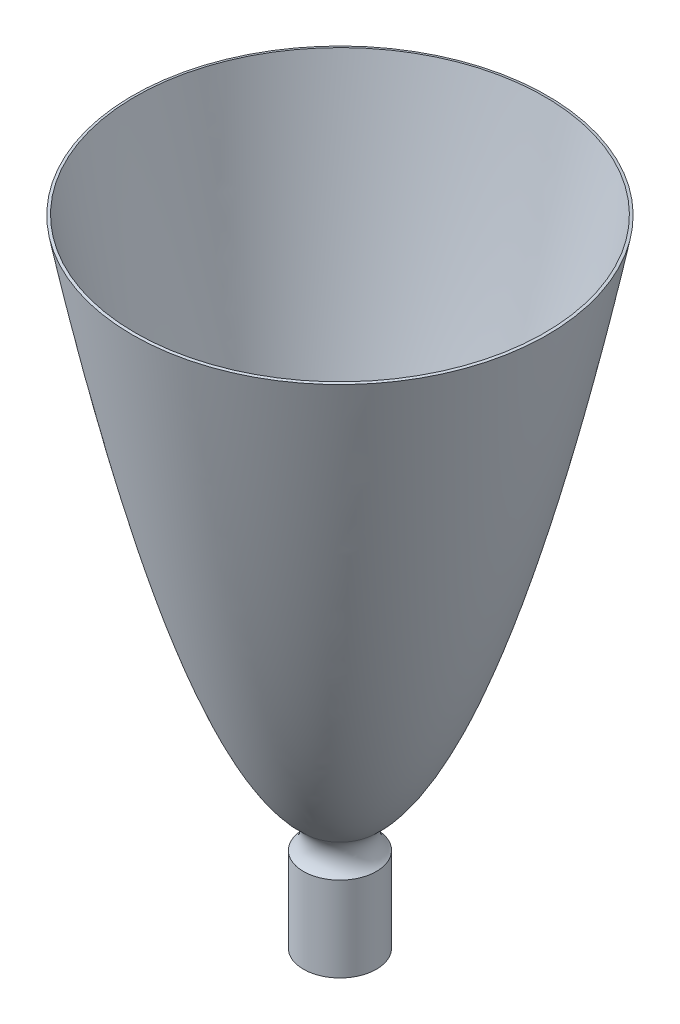
ISO-10303-21;
HEADER;
FILE_DESCRIPTION(('STEP AP214'),'2;1');
FILE_NAME('part.step','',(''),(''),'','','');
FILE_SCHEMA(('AUTOMOTIVE_DESIGN { 1 0 10303 214 1 1 1 1 }'));
ENDSEC;
DATA;
#1=APPLICATION_CONTEXT('core data for automotive mechanical design processes');
#2=APPLICATION_PROTOCOL_DEFINITION('international standard','automotive_design',2000,#1);
#3=PRODUCT_CONTEXT('',#1,'mechanical');
#4=PRODUCT('Part','Part','',(#3));
#5=PRODUCT_RELATED_PRODUCT_CATEGORY('part','',(#4));
#6=PRODUCT_DEFINITION_FORMATION('','',#4);
#7=PRODUCT_DEFINITION_CONTEXT('part definition',#1,'design');
#8=PRODUCT_DEFINITION('design','',#6,#7);
#9=PRODUCT_DEFINITION_SHAPE('','',#8);
#10=(LENGTH_UNIT() NAMED_UNIT(*) SI_UNIT(.MILLI.,.METRE.));
#11=(NAMED_UNIT(*) PLANE_ANGLE_UNIT() SI_UNIT($,.RADIAN.));
#12=(NAMED_UNIT(*) SI_UNIT($,.STERADIAN.) SOLID_ANGLE_UNIT());
#13=UNCERTAINTY_MEASURE_WITH_UNIT(LENGTH_MEASURE(1.E-05),#10,'distance_accuracy_value','');
#14=(GEOMETRIC_REPRESENTATION_CONTEXT(3) GLOBAL_UNCERTAINTY_ASSIGNED_CONTEXT((#13)) GLOBAL_UNIT_ASSIGNED_CONTEXT((#10,
#11,#12)) REPRESENTATION_CONTEXT('',''));
#15=CARTESIAN_POINT('',(0.,0.,0.));
#16=DIRECTION('',(0.,0.,1.));
#17=DIRECTION('',(1.,0.,0.));
#18=AXIS2_PLACEMENT_3D('',#15,#16,#17);
#19=CARTESIAN_POINT('',(33.4317283795413,14.7681864530451,0.));
#20=CARTESIAN_POINT('',(40.1526633748622,20.706020120395,0.));
#21=CARTESIAN_POINT('',(46.8734926912518,28.4341051519288,0.));
#22=CARTESIAN_POINT('',(56.9503935464347,42.7106064375808,0.));
#23=CARTESIAN_POINT('',(60.312329429045,47.917387760746,0.));
#24=CARTESIAN_POINT('',(67.0353496296569,59.226736696009,0.));
#25=CARTESIAN_POINT('',(70.3950128066117,65.3280228705894,0.));
#26=CARTESIAN_POINT('',(80.4740356062345,84.9747523838495,0.));
#27=CARTESIAN_POINT('',(87.1965601435105,99.8657860073513,0.));
#28=CARTESIAN_POINT('',(100.636725309072,133.22378972176,0.));
#29=CARTESIAN_POINT('',(107.355431324887,151.691647576192,0.));
#30=CARTESIAN_POINT('',(120.79641809306,192.212247609179,0.));
#31=CARTESIAN_POINT('',(127.51897984491,214.26553599326,0.));
#32=CARTESIAN_POINT('',(140.960289208364,261.947070252184,0.));
#33=CARTESIAN_POINT('',(147.680243148661,287.577001052271,0.));
#34=CARTESIAN_POINT('',(161.120257946311,342.417805076249,0.));
#35=CARTESIAN_POINT('',(167.840302796953,371.628661639528,0.));
#36=CARTESIAN_POINT('',(177.921046214024,418.131882485711,0.));
#37=CARTESIAN_POINT('',(181.281402903081,434.080772996879,0.));
#38=CARTESIAN_POINT('',(186.322152305084,458.675948553948,0.));
#39=CARTESIAN_POINT('',(188.842580383133,471.14149591459,0.));
#40=CARTESIAN_POINT('',(191.363096390975,483.859001126796,0.));
#41=CARTESIAN_POINT('',(193.043460709807,492.393330440399,0.));
#42=CARTESIAN_POINT('',(193.883488745873,496.687236509289,0.));
#43=CARTESIAN_POINT('',(194.723862640943,501.01169001703,0.));
#44=B_SPLINE_CURVE_WITH_KNOTS('',3,(#19,#20,#21,#22,#23,#24,#25,#26,#27,#28,#29,#30,#31,#32,#33,
#34,#35,#36,#37,#38,#39,#40,#41,#42,#43),.UNSPECIFIED.,.F.,.F.,(4,2,2,2,2,2,2,2,2,2,1,2,4),(0.,
0.125,0.1875,0.25,0.375,0.5,0.625,0.75,0.875,0.9375,0.96875,0.984375,1.),.UNSPECIFIED.);
#45=CARTESIAN_POINT('',(0.,587.51736990655,0.));
#46=DIRECTION('',(0.,1.,0.));
#47=AXIS1_PLACEMENT('',#45,#46);
#48=SURFACE_OF_REVOLUTION('',#44,#47);
#49=CARTESIAN_POINT('',(0.,501.011690017031,0.));
#50=DIRECTION('',(0.,1.,0.));
#51=DIRECTION('',(0.,0.,1.));
#52=AXIS2_PLACEMENT_3D('',#49,#50,#51);
#53=CIRCLE('',#52,194.723862640943);
#54=CARTESIAN_POINT('',(0.,501.011690017031,194.723862640943));
#55=VERTEX_POINT('',#54);
#56=EDGE_CURVE('E79',#55,#55,#53,.T.);
#57=ORIENTED_EDGE('',*,*,#56,.F.);
#58=EDGE_LOOP('',(#57));
#59=FACE_BOUND('',#58,.T.);
#60=CARTESIAN_POINT('',(0.,14.7681864530451,0.));
#61=DIRECTION('',(0.,1.,0.));
#62=DIRECTION('',(0.,0.,1.));
#63=AXIS2_PLACEMENT_3D('',#60,#61,#62);
#64=CIRCLE('',#63,33.4317283795413);
#65=CARTESIAN_POINT('',(0.,14.7681864530451,33.4317283795413));
#66=VERTEX_POINT('',#65);
#67=EDGE_CURVE('E10',#66,#66,#64,.T.);
#68=ORIENTED_EDGE('',*,*,#67,.T.);
#69=EDGE_LOOP('',(#68));
#70=FACE_BOUND('',#69,.T.);
#71=ADVANCED_FACE('F43',(#59,#70),#48,.T.);
#72=CARTESIAN_POINT('',(0.,0.,0.));
#73=DIRECTION('',(0.,1.,0.));
#74=DIRECTION('',(0.,0.,1.));
#75=AXIS2_PLACEMENT_3D('',#72,#73,#74);
#76=TOROIDAL_SURFACE('',#75,46.4791741274384,19.706221648409);
#77=ORIENTED_EDGE('',*,*,#67,.F.);
#78=EDGE_LOOP('',(#77));
#79=FACE_BOUND('',#78,.T.);
#80=CARTESIAN_POINT('',(0.,-15.4841598334302,0.));
#81=DIRECTION('',(0.,1.,0.));
#82=DIRECTION('',(0.,0.,1.));
#83=AXIS2_PLACEMENT_3D('',#80,#81,#82);
#84=CIRCLE('',#83,34.2900000000001);
#85=CARTESIAN_POINT('',(0.,-15.4841598334302,34.2900000000001));
#86=VERTEX_POINT('',#85);
#87=EDGE_CURVE('E51',#86,#86,#84,.T.);
#88=ORIENTED_EDGE('',*,*,#87,.T.);
#89=EDGE_LOOP('',(#88));
#90=FACE_BOUND('',#89,.T.);
#91=ADVANCED_FACE('F117',(#79,#90),#76,.F.);
#92=CARTESIAN_POINT('',(0.,587.51736990655,0.));
#93=DIRECTION('',(0.,1.,0.));
#94=DIRECTION('',(0.,0.,1.));
#95=AXIS2_PLACEMENT_3D('',#92,#93,#94);
#96=CYLINDRICAL_SURFACE('',#95,34.2900000000001);
#97=ORIENTED_EDGE('',*,*,#87,.F.);
#98=EDGE_LOOP('',(#97));
#99=FACE_BOUND('',#98,.T.);
#100=CARTESIAN_POINT('',(0.,-95.0882932141384,0.));
#101=DIRECTION('',(0.,1.,0.));
#102=DIRECTION('',(0.,0.,1.));
#103=AXIS2_PLACEMENT_3D('',#100,#101,#102);
#104=CIRCLE('',#103,34.2900000000001);
#105=CARTESIAN_POINT('',(0.,-95.0882932141384,34.2900000000001));
#106=VERTEX_POINT('',#105);
#107=EDGE_CURVE('E56',#106,#106,#104,.T.);
#108=ORIENTED_EDGE('',*,*,#107,.T.);
#109=EDGE_LOOP('',(#108));
#110=FACE_BOUND('',#109,.T.);
#111=ADVANCED_FACE('F114',(#99,#110),#96,.T.);
#112=CARTESIAN_POINT('',(0.,-95.0882932141384,0.));
#113=DIRECTION('',(0.,1.,0.));
#114=DIRECTION('',(0.,0.,1.));
#115=AXIS2_PLACEMENT_3D('',#112,#113,#114);
#116=PLANE('',#115);
#117=ORIENTED_EDGE('',*,*,#107,.F.);
#118=EDGE_LOOP('',(#117));
#119=FACE_BOUND('',#118,.T.);
#120=ADVANCED_FACE('F110',(#119),#116,.F.);
#121=CARTESIAN_POINT('',(0.,-92.5482932141384,0.));
#122=DIRECTION('',(0.,1.,0.));
#123=DIRECTION('',(0.,0.,1.));
#124=AXIS2_PLACEMENT_3D('',#121,#122,#123);
#125=PLANE('',#124);
#126=CARTESIAN_POINT('',(0.,-92.5482932141384,0.));
#127=DIRECTION('',(0.,1.,0.));
#128=DIRECTION('',(0.,0.,1.));
#129=AXIS2_PLACEMENT_3D('',#126,#127,#128);
#130=CIRCLE('',#129,31.7500000000001);
#131=CARTESIAN_POINT('',(0.,-92.5482932141384,31.7500000000001));
#132=VERTEX_POINT('',#131);
#133=EDGE_CURVE('E61',#132,#132,#130,.T.);
#134=ORIENTED_EDGE('',*,*,#133,.T.);
#135=EDGE_LOOP('',(#134));
#136=FACE_BOUND('',#135,.T.);
#137=ADVANCED_FACE('F106',(#136),#125,.T.);
#138=CARTESIAN_POINT('',(0.,587.51736990655,0.));
#139=DIRECTION('',(0.,1.,0.));
#140=DIRECTION('',(0.,0.,1.));
#141=AXIS2_PLACEMENT_3D('',#138,#139,#140);
#142=CYLINDRICAL_SURFACE('',#141,31.7500000000001);
#143=CARTESIAN_POINT('',(0.,-16.6717067858616,0.));
#144=DIRECTION('',(0.,1.,0.));
#145=DIRECTION('',(0.,0.,1.));
#146=AXIS2_PLACEMENT_3D('',#143,#144,#145);
#147=CIRCLE('',#146,31.7500000000001);
#148=CARTESIAN_POINT('',(0.,-16.6717067858616,31.7500000000001));
#149=VERTEX_POINT('',#148);
#150=EDGE_CURVE('E67',#149,#149,#147,.T.);
#151=ORIENTED_EDGE('',*,*,#150,.T.);
#152=EDGE_LOOP('',(#151));
#153=FACE_BOUND('',#152,.T.);
#154=ORIENTED_EDGE('',*,*,#133,.F.);
#155=EDGE_LOOP('',(#154));
#156=FACE_BOUND('',#155,.T.);
#157=ADVANCED_FACE('F102',(#153,#156),#142,.F.);
#158=CARTESIAN_POINT('',(0.,0.,0.));
#159=DIRECTION('',(0.,1.,0.));
#160=DIRECTION('',(0.,0.,1.));
#161=AXIS2_PLACEMENT_3D('',#158,#159,#160);
#162=TOROIDAL_SURFACE('',#161,46.4791741274384,22.246221648409);
#163=CARTESIAN_POINT('',(0.,16.6717067858616,0.));
#164=DIRECTION('',(0.,1.,0.));
#165=DIRECTION('',(0.,0.,1.));
#166=AXIS2_PLACEMENT_3D('',#163,#164,#165);
#167=CIRCLE('',#166,31.7500000000001);
#168=CARTESIAN_POINT('',(0.,16.6717067858616,31.7500000000001));
#169=VERTEX_POINT('',#168);
#170=EDGE_CURVE('E71',#169,#169,#167,.T.);
#171=ORIENTED_EDGE('',*,*,#170,.T.);
#172=EDGE_LOOP('',(#171));
#173=FACE_BOUND('',#172,.T.);
#174=ORIENTED_EDGE('',*,*,#150,.F.);
#175=EDGE_LOOP('',(#174));
#176=FACE_BOUND('',#175,.T.);
#177=ADVANCED_FACE('F98',(#173,#176),#162,.T.);
#178=CARTESIAN_POINT('',(3.4828607971947E-10,2.54,0.));
#179=CARTESIAN_POINT('',(2.83970586502624,2.53999999961062,0.));
#180=CARTESIAN_POINT('',(11.3731922342425,3.9078004735028,0.));
#181=CARTESIAN_POINT('',(22.9254905156138,9.47212205459639,0.));
#182=CARTESIAN_POINT('',(28.8224071989365,14.202412039396,0.));
#183=CARTESIAN_POINT('',(31.770689513779,16.5728010931047,0.));
#184=CARTESIAN_POINT('',(37.7065965945908,22.2940583895225,0.));
#185=CARTESIAN_POINT('',(49.6738892642853,35.76641625901,0.));
#186=CARTESIAN_POINT('',(70.786158846255,69.7144420284238,0.));
#187=CARTESIAN_POINT('',(101.098388009374,137.978478970352,0.));
#188=CARTESIAN_POINT('',(155.748369909538,313.804629305549,0.));
#189=CARTESIAN_POINT('',(192.230508367063,501.496222523369,0.));
#190=CARTESIAN_POINT('',(192.289307015679,501.798858239123,0.));
#191=CARTESIAN_POINT('',(192.324599934763,501.980535512685,0.));
#192=B_SPLINE_CURVE_WITH_KNOTS('',2,(#178,#179,#180,#181,#182,#183,#184,#185,#186,#187,#188,
#189,#190,#191),.UNSPECIFIED.,.F.,.F.,(3,1,1,1,1,1,1,1,1,1,1,1,3),(0.0867267664764181,
0.113828881006781,0.168033110067505,0.222003112264922,0.22223733912823,0.249105226795284,
0.276441568188955,0.357747911780043,0.466156369901493,0.628769057083667,0.953470594539996,
0.953680129303204,0.953994431448017),.UNSPECIFIED.);
#193=CARTESIAN_POINT('',(0.,587.51736990655,0.));
#194=DIRECTION('',(0.,1.,0.));
#195=AXIS1_PLACEMENT('',#193,#194);
#196=SURFACE_OF_REVOLUTION('',#192,#195);
#197=CARTESIAN_POINT('',(0.,501.496225573682,0.));
#198=DIRECTION('',(0.,1.,0.));
#199=DIRECTION('',(0.,0.,1.));
#200=AXIS2_PLACEMENT_3D('',#197,#198,#199);
#201=CIRCLE('',#200,192.230506410008);
#202=CARTESIAN_POINT('',(0.,501.496225573682,192.230506410008));
#203=VERTEX_POINT('',#202);
#204=EDGE_CURVE('E75',#203,#203,#201,.T.);
#205=ORIENTED_EDGE('',*,*,#204,.T.);
#206=EDGE_LOOP('',(#205));
#207=FACE_BOUND('',#206,.T.);
#208=ORIENTED_EDGE('',*,*,#170,.F.);
#209=EDGE_LOOP('',(#208));
#210=FACE_BOUND('',#209,.T.);
#211=ADVANCED_FACE('F93',(#207,#210),#196,.F.);
#212=CARTESIAN_POINT('',(0.,501.496225573682,0.));
#213=DIRECTION('',(0.,-1.,0.));
#214=DIRECTION('',(0.,0.,-1.));
#215=AXIS2_PLACEMENT_3D('',#212,#213,#214);
#216=CONICAL_SURFACE('',#215,192.230506410008,1.37885795308533);
#217=ORIENTED_EDGE('',*,*,#56,.T.);
#218=EDGE_LOOP('',(#217));
#219=FACE_BOUND('',#218,.T.);
#220=ORIENTED_EDGE('',*,*,#204,.F.);
#221=EDGE_LOOP('',(#220));
#222=FACE_BOUND('',#221,.T.);
#223=ADVANCED_FACE('F97',(#219,#222),#216,.T.);
#224=CLOSED_SHELL('',(#71,#91,#111,#120,#137,#157,#177,#211,#223));
#225=MANIFOLD_SOLID_BREP('B2',#224);
#226=ADVANCED_BREP_SHAPE_REPRESENTATION('',(#18,#225),#14);
#227=SHAPE_DEFINITION_REPRESENTATION(#9,#226);
ENDSEC;
END-ISO-10303-21;
